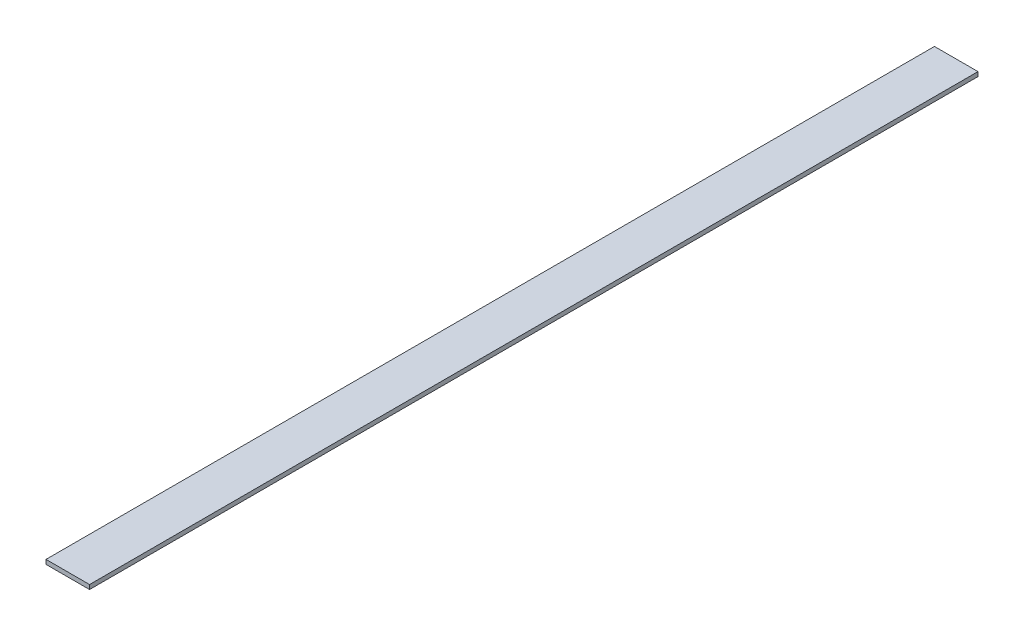
ISO-10303-21;
HEADER;
FILE_DESCRIPTION(('STEP AP214'),'2;1');
FILE_NAME('part.step','',(''),(''),'','','');
FILE_SCHEMA(('AUTOMOTIVE_DESIGN { 1 0 10303 214 1 1 1 1 }'));
ENDSEC;
DATA;
#1=APPLICATION_CONTEXT('core data for automotive mechanical design processes');
#2=APPLICATION_PROTOCOL_DEFINITION('international standard','automotive_design',2000,#1);
#3=PRODUCT_CONTEXT('',#1,'mechanical');
#4=PRODUCT('Part','Part','',(#3));
#5=PRODUCT_RELATED_PRODUCT_CATEGORY('part','',(#4));
#6=PRODUCT_DEFINITION_FORMATION('','',#4);
#7=PRODUCT_DEFINITION_CONTEXT('part definition',#1,'design');
#8=PRODUCT_DEFINITION('design','',#6,#7);
#9=PRODUCT_DEFINITION_SHAPE('','',#8);
#10=(LENGTH_UNIT() NAMED_UNIT(*) SI_UNIT(.MILLI.,.METRE.));
#11=(NAMED_UNIT(*) PLANE_ANGLE_UNIT() SI_UNIT($,.RADIAN.));
#12=(NAMED_UNIT(*) SI_UNIT($,.STERADIAN.) SOLID_ANGLE_UNIT());
#13=UNCERTAINTY_MEASURE_WITH_UNIT(LENGTH_MEASURE(1.E-05),#10,'distance_accuracy_value','');
#14=(GEOMETRIC_REPRESENTATION_CONTEXT(3) GLOBAL_UNCERTAINTY_ASSIGNED_CONTEXT((#13)) GLOBAL_UNIT_ASSIGNED_CONTEXT((#10,
#11,#12)) REPRESENTATION_CONTEXT('',''));
#15=CARTESIAN_POINT('',(0.,0.,0.));
#16=DIRECTION('',(0.,0.,1.));
#17=DIRECTION('',(1.,0.,0.));
#18=AXIS2_PLACEMENT_3D('',#15,#16,#17);
#19=CARTESIAN_POINT('',(5.,5.,1020.));
#20=DIRECTION('',(1.,0.,0.));
#21=DIRECTION('',(0.,0.,-1.));
#22=AXIS2_PLACEMENT_3D('',#19,#20,#21);
#23=PLANE('',#22);
#24=DIRECTION('',(0.,-1.,0.));
#25=VECTOR('',#24,1.);
#26=CARTESIAN_POINT('',(5.,5.,0.));
#27=LINE('',#26,#25);
#28=CARTESIAN_POINT('',(5.,5.,0.));
#29=VERTEX_POINT('',#28);
#30=CARTESIAN_POINT('',(5.,0.,0.));
#31=VERTEX_POINT('',#30);
#32=EDGE_CURVE('E99',#29,#31,#27,.T.);
#33=ORIENTED_EDGE('',*,*,#32,.T.);
#34=DIRECTION('',(0.,0.,-1.));
#35=VECTOR('',#34,1.);
#36=CARTESIAN_POINT('',(5.,0.,1020.));
#37=LINE('',#36,#35);
#38=CARTESIAN_POINT('',(5.,0.,1020.));
#39=VERTEX_POINT('',#38);
#40=EDGE_CURVE('E11',#39,#31,#37,.T.);
#41=ORIENTED_EDGE('',*,*,#40,.F.);
#42=DIRECTION('',(0.,-1.,0.));
#43=VECTOR('',#42,1.);
#44=CARTESIAN_POINT('',(5.,5.,1020.));
#45=LINE('',#44,#43);
#46=CARTESIAN_POINT('',(5.,5.,1020.));
#47=VERTEX_POINT('',#46);
#48=EDGE_CURVE('E85',#47,#39,#45,.T.);
#49=ORIENTED_EDGE('',*,*,#48,.F.);
#50=DIRECTION('',(0.,0.,-1.));
#51=VECTOR('',#50,1.);
#52=CARTESIAN_POINT('',(5.,5.,1020.));
#53=LINE('',#52,#51);
#54=EDGE_CURVE('E95',#47,#29,#53,.T.);
#55=ORIENTED_EDGE('',*,*,#54,.T.);
#56=EDGE_LOOP('',(#33,#41,#49,#55));
#57=FACE_BOUND('',#56,.T.);
#58=ADVANCED_FACE('F35',(#57),#23,.F.);
#59=CARTESIAN_POINT('',(5.,0.,1020.));
#60=DIRECTION('',(0.,1.,0.));
#61=DIRECTION('',(0.,0.,1.));
#62=AXIS2_PLACEMENT_3D('',#59,#60,#61);
#63=PLANE('',#62);
#64=DIRECTION('',(1.,0.,0.));
#65=VECTOR('',#64,1.);
#66=CARTESIAN_POINT('',(5.,0.,0.));
#67=LINE('',#66,#65);
#68=CARTESIAN_POINT('',(55.,0.,0.));
#69=VERTEX_POINT('',#68);
#70=EDGE_CURVE('E90',#31,#69,#67,.T.);
#71=ORIENTED_EDGE('',*,*,#70,.T.);
#72=DIRECTION('',(0.,0.,-1.));
#73=VECTOR('',#72,1.);
#74=CARTESIAN_POINT('',(55.,0.,1020.));
#75=LINE('',#74,#73);
#76=CARTESIAN_POINT('',(55.,0.,1020.));
#77=VERTEX_POINT('',#76);
#78=EDGE_CURVE('E43',#77,#69,#75,.T.);
#79=ORIENTED_EDGE('',*,*,#78,.F.);
#80=DIRECTION('',(1.,0.,0.));
#81=VECTOR('',#80,1.);
#82=CARTESIAN_POINT('',(5.,0.,1020.));
#83=LINE('',#82,#81);
#84=EDGE_CURVE('E79',#39,#77,#83,.T.);
#85=ORIENTED_EDGE('',*,*,#84,.F.);
#86=ORIENTED_EDGE('',*,*,#40,.T.);
#87=EDGE_LOOP('',(#71,#79,#85,#86));
#88=FACE_BOUND('',#87,.T.);
#89=ADVANCED_FACE('F89',(#88),#63,.F.);
#90=CARTESIAN_POINT('',(55.,5.00000000000001,1020.));
#91=DIRECTION('',(-1.,0.,0.));
#92=DIRECTION('',(0.,0.,1.));
#93=AXIS2_PLACEMENT_3D('',#90,#91,#92);
#94=PLANE('',#93);
#95=DIRECTION('',(0.,1.,0.));
#96=VECTOR('',#95,1.);
#97=CARTESIAN_POINT('',(55.,5.00000000000001,0.));
#98=LINE('',#97,#96);
#99=CARTESIAN_POINT('',(55.,5.00000000000001,0.));
#100=VERTEX_POINT('',#99);
#101=EDGE_CURVE('E103',#69,#100,#98,.T.);
#102=ORIENTED_EDGE('',*,*,#101,.T.);
#103=DIRECTION('',(0.,0.,-1.));
#104=VECTOR('',#103,1.);
#105=CARTESIAN_POINT('',(55.,5.00000000000001,1020.));
#106=LINE('',#105,#104);
#107=CARTESIAN_POINT('',(55.,5.00000000000001,1020.));
#108=VERTEX_POINT('',#107);
#109=EDGE_CURVE('E92',#108,#100,#106,.T.);
#110=ORIENTED_EDGE('',*,*,#109,.F.);
#111=DIRECTION('',(0.,1.,0.));
#112=VECTOR('',#111,1.);
#113=CARTESIAN_POINT('',(55.,5.00000000000001,1020.));
#114=LINE('',#113,#112);
#115=EDGE_CURVE('E82',#77,#108,#114,.T.);
#116=ORIENTED_EDGE('',*,*,#115,.F.);
#117=ORIENTED_EDGE('',*,*,#78,.T.);
#118=EDGE_LOOP('',(#102,#110,#116,#117));
#119=FACE_BOUND('',#118,.T.);
#120=ADVANCED_FACE('F93',(#119),#94,.F.);
#121=CARTESIAN_POINT('',(15.,5.,1020.));
#122=DIRECTION('',(0.,-1.,0.));
#123=DIRECTION('',(1.,0.,0.));
#124=AXIS2_PLACEMENT_3D('',#121,#122,#123);
#125=PLANE('',#124);
#126=DIRECTION('',(-1.,0.,0.));
#127=VECTOR('',#126,1.);
#128=CARTESIAN_POINT('',(15.,5.,0.));
#129=LINE('',#128,#127);
#130=EDGE_CURVE('E68',#100,#29,#129,.T.);
#131=ORIENTED_EDGE('',*,*,#130,.T.);
#132=ORIENTED_EDGE('',*,*,#54,.F.);
#133=DIRECTION('',(-1.,0.,0.));
#134=VECTOR('',#133,1.);
#135=CARTESIAN_POINT('',(55.,5.00000000000001,1020.));
#136=LINE('',#135,#134);
#137=EDGE_CURVE('E51',#108,#47,#136,.T.);
#138=ORIENTED_EDGE('',*,*,#137,.F.);
#139=ORIENTED_EDGE('',*,*,#109,.T.);
#140=EDGE_LOOP('',(#131,#132,#138,#139));
#141=FACE_BOUND('',#140,.T.);
#142=ADVANCED_FACE('F107',(#141),#125,.F.);
#143=CARTESIAN_POINT('',(0.,0.,1020.));
#144=DIRECTION('',(0.,0.,1.));
#145=DIRECTION('',(1.,0.,0.));
#146=AXIS2_PLACEMENT_3D('',#143,#144,#145);
#147=PLANE('',#146);
#148=ORIENTED_EDGE('',*,*,#48,.T.);
#149=ORIENTED_EDGE('',*,*,#84,.T.);
#150=ORIENTED_EDGE('',*,*,#115,.T.);
#151=ORIENTED_EDGE('',*,*,#137,.T.);
#152=EDGE_LOOP('',(#148,#149,#150,#151));
#153=FACE_BOUND('',#152,.T.);
#154=ADVANCED_FACE('F80',(#153),#147,.T.);
#155=CARTESIAN_POINT('',(0.,0.,0.));
#156=DIRECTION('',(0.,0.,1.));
#157=DIRECTION('',(1.,0.,0.));
#158=AXIS2_PLACEMENT_3D('',#155,#156,#157);
#159=PLANE('',#158);
#160=ORIENTED_EDGE('',*,*,#32,.F.);
#161=ORIENTED_EDGE('',*,*,#130,.F.);
#162=ORIENTED_EDGE('',*,*,#101,.F.);
#163=ORIENTED_EDGE('',*,*,#70,.F.);
#164=EDGE_LOOP('',(#160,#161,#162,#163));
#165=FACE_BOUND('',#164,.T.);
#166=ADVANCED_FACE('F109',(#165),#159,.F.);
#167=CLOSED_SHELL('',(#58,#89,#120,#142,#154,#166));
#168=MANIFOLD_SOLID_BREP('B2',#167);
#169=ADVANCED_BREP_SHAPE_REPRESENTATION('',(#18,#168),#14);
#170=SHAPE_DEFINITION_REPRESENTATION(#9,#169);
ENDSEC;
END-ISO-10303-21;
